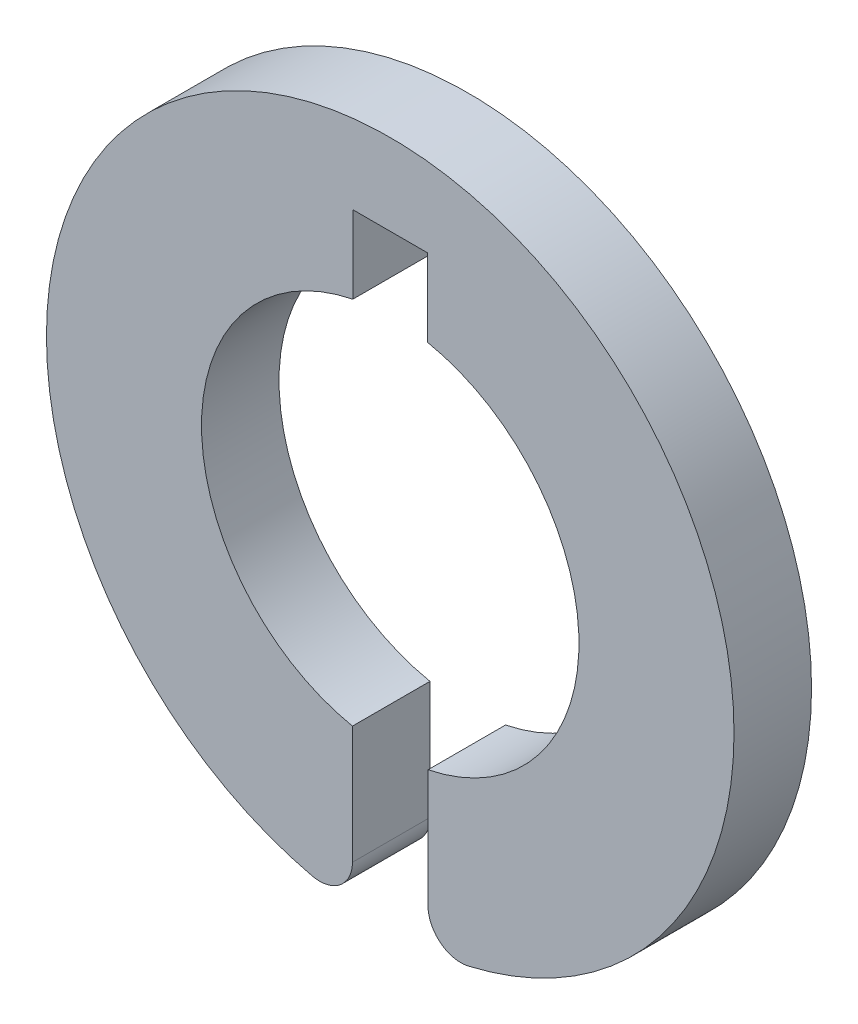
ISO-10303-21;
HEADER;
FILE_DESCRIPTION(('STEP AP214'),'2;1');
FILE_NAME('part.step','',(''),(''),'','','');
FILE_SCHEMA(('AUTOMOTIVE_DESIGN { 1 0 10303 214 1 1 1 1 }'));
ENDSEC;
DATA;
#1=APPLICATION_CONTEXT('core data for automotive mechanical design processes');
#2=APPLICATION_PROTOCOL_DEFINITION('international standard','automotive_design',2000,#1);
#3=PRODUCT_CONTEXT('',#1,'mechanical');
#4=PRODUCT('Part','Part','',(#3));
#5=PRODUCT_RELATED_PRODUCT_CATEGORY('part','',(#4));
#6=PRODUCT_DEFINITION_FORMATION('','',#4);
#7=PRODUCT_DEFINITION_CONTEXT('part definition',#1,'design');
#8=PRODUCT_DEFINITION('design','',#6,#7);
#9=PRODUCT_DEFINITION_SHAPE('','',#8);
#10=(LENGTH_UNIT() NAMED_UNIT(*) SI_UNIT(.MILLI.,.METRE.));
#11=(NAMED_UNIT(*) PLANE_ANGLE_UNIT() SI_UNIT($,.RADIAN.));
#12=(NAMED_UNIT(*) SI_UNIT($,.STERADIAN.) SOLID_ANGLE_UNIT());
#13=UNCERTAINTY_MEASURE_WITH_UNIT(LENGTH_MEASURE(1.E-05),#10,'distance_accuracy_value','');
#14=(GEOMETRIC_REPRESENTATION_CONTEXT(3) GLOBAL_UNCERTAINTY_ASSIGNED_CONTEXT((#13)) GLOBAL_UNIT_ASSIGNED_CONTEXT((#10,
#11,#12)) REPRESENTATION_CONTEXT('',''));
#15=CARTESIAN_POINT('',(0.,0.,0.));
#16=DIRECTION('',(0.,0.,1.));
#17=DIRECTION('',(1.,0.,0.));
#18=AXIS2_PLACEMENT_3D('',#15,#16,#17);
#19=CARTESIAN_POINT('',(0.,0.,3.));
#20=DIRECTION('',(0.,0.,-1.));
#21=DIRECTION('',(-1.,0.,0.));
#22=AXIS2_PLACEMENT_3D('',#19,#20,#21);
#23=CYLINDRICAL_SURFACE('',#22,7.3025);
#24=CARTESIAN_POINT('',(0.,0.,0.));
#25=DIRECTION('',(0.,0.,-1.));
#26=DIRECTION('',(1.,0.,0.));
#27=AXIS2_PLACEMENT_3D('',#24,#25,#26);
#28=CIRCLE('',#27,7.3025);
#29=CARTESIAN_POINT('',(1.4475,7.15760085503516,0.));
#30=VERTEX_POINT('',#29);
#31=CARTESIAN_POINT('',(1.4625,-7.15455099918926,0.));
#32=VERTEX_POINT('',#31);
#33=EDGE_CURVE('E138',#30,#32,#28,.T.);
#34=ORIENTED_EDGE('',*,*,#33,.T.);
#35=DIRECTION('',(0.,0.,-1.));
#36=VECTOR('',#35,1.);
#37=CARTESIAN_POINT('',(1.4625,-7.15455099918926,3.));
#38=LINE('',#37,#36);
#39=CARTESIAN_POINT('',(1.4625,-7.15455099918926,3.));
#40=VERTEX_POINT('',#39);
#41=EDGE_CURVE('E125',#40,#32,#38,.T.);
#42=ORIENTED_EDGE('',*,*,#41,.F.);
#43=CARTESIAN_POINT('',(0.,0.,3.));
#44=DIRECTION('',(0.,0.,-1.));
#45=DIRECTION('',(1.,0.,0.));
#46=AXIS2_PLACEMENT_3D('',#43,#44,#45);
#47=CIRCLE('',#46,7.3025);
#48=CARTESIAN_POINT('',(1.4475,7.15760085503516,3.));
#49=VERTEX_POINT('',#48);
#50=EDGE_CURVE('E130',#49,#40,#47,.T.);
#51=ORIENTED_EDGE('',*,*,#50,.F.);
#52=DIRECTION('',(0.,0.,-1.));
#53=VECTOR('',#52,1.);
#54=CARTESIAN_POINT('',(1.4475,7.15760085503516,3.));
#55=LINE('',#54,#53);
#56=EDGE_CURVE('E183',#49,#30,#55,.T.);
#57=ORIENTED_EDGE('',*,*,#56,.T.);
#58=EDGE_LOOP('',(#34,#42,#51,#57));
#59=FACE_BOUND('',#58,.T.);
#60=ADVANCED_FACE('F45',(#59),#23,.F.);
#61=CARTESIAN_POINT('',(1.4625,-13.2218606860003,3.));
#62=DIRECTION('',(1.,0.,0.));
#63=DIRECTION('',(0.,0.,-1.));
#64=AXIS2_PLACEMENT_3D('',#61,#62,#63);
#65=PLANE('',#64);
#66=DIRECTION('',(0.,-1.,0.));
#67=VECTOR('',#66,1.);
#68=CARTESIAN_POINT('',(1.4625,-13.2218606860003,0.));
#69=LINE('',#68,#67);
#70=CARTESIAN_POINT('',(1.4625,-11.7181269834389,0.));
#71=VERTEX_POINT('',#70);
#72=EDGE_CURVE('E186',#32,#71,#69,.T.);
#73=ORIENTED_EDGE('',*,*,#72,.T.);
#74=DIRECTION('',(0.,0.,-1.));
#75=VECTOR('',#74,1.);
#76=CARTESIAN_POINT('',(1.4625,-11.7181269834389,3.));
#77=LINE('',#76,#75);
#78=CARTESIAN_POINT('',(1.4625,-11.7181269834389,3.));
#79=VERTEX_POINT('',#78);
#80=EDGE_CURVE('E12',#71,#79,#77,.F.);
#81=ORIENTED_EDGE('',*,*,#80,.T.);
#82=DIRECTION('',(0.,-1.,0.));
#83=VECTOR('',#82,1.);
#84=CARTESIAN_POINT('',(1.4625,-13.2218606860003,3.));
#85=LINE('',#84,#83);
#86=EDGE_CURVE('E120',#40,#79,#85,.T.);
#87=ORIENTED_EDGE('',*,*,#86,.F.);
#88=ORIENTED_EDGE('',*,*,#41,.T.);
#89=EDGE_LOOP('',(#73,#81,#87,#88));
#90=FACE_BOUND('',#89,.T.);
#91=ADVANCED_FACE('F117',(#90),#65,.F.);
#92=CARTESIAN_POINT('',(0.,0.,3.));
#93=DIRECTION('',(0.,0.,-1.));
#94=DIRECTION('',(-1.,0.,0.));
#95=AXIS2_PLACEMENT_3D('',#92,#93,#94);
#96=CYLINDRICAL_SURFACE('',#95,13.3025);
#97=CARTESIAN_POINT('',(0.,0.,0.));
#98=DIRECTION('',(0.,0.,1.));
#99=DIRECTION('',(-1.,0.,0.));
#100=AXIS2_PLACEMENT_3D('',#97,#98,#99);
#101=CIRCLE('',#100,13.3025);
#102=CARTESIAN_POINT('',(3.02090847704135,-12.9549457051483,0.));
#103=VERTEX_POINT('',#102);
#104=CARTESIAN_POINT('',(-3.02090847704135,-12.9549457051483,0.));
#105=VERTEX_POINT('',#104);
#106=EDGE_CURVE('E188',#103,#105,#101,.T.);
#107=ORIENTED_EDGE('',*,*,#106,.T.);
#108=DIRECTION('',(0.,0.,-1.));
#109=VECTOR('',#108,1.);
#110=CARTESIAN_POINT('',(-3.02090847704135,-12.9549457051483,3.));
#111=LINE('',#110,#109);
#112=CARTESIAN_POINT('',(-3.02090847704135,-12.9549457051483,3.));
#113=VERTEX_POINT('',#112);
#114=EDGE_CURVE('E65',#105,#113,#111,.F.);
#115=ORIENTED_EDGE('',*,*,#114,.T.);
#116=CARTESIAN_POINT('',(0.,0.,3.));
#117=DIRECTION('',(0.,0.,1.));
#118=DIRECTION('',(-1.,0.,0.));
#119=AXIS2_PLACEMENT_3D('',#116,#117,#118);
#120=CIRCLE('',#119,13.3025);
#121=CARTESIAN_POINT('',(3.02090847704135,-12.9549457051483,3.));
#122=VERTEX_POINT('',#121);
#123=EDGE_CURVE('E127',#122,#113,#120,.T.);
#124=ORIENTED_EDGE('',*,*,#123,.F.);
#125=DIRECTION('',(0.,0.,-1.));
#126=VECTOR('',#125,1.);
#127=CARTESIAN_POINT('',(3.02090847704135,-12.9549457051483,3.));
#128=LINE('',#127,#126);
#129=EDGE_CURVE('E152',#122,#103,#128,.T.);
#130=ORIENTED_EDGE('',*,*,#129,.T.);
#131=EDGE_LOOP('',(#107,#115,#124,#130));
#132=FACE_BOUND('',#131,.T.);
#133=ADVANCED_FACE('F231',(#132),#96,.T.);
#134=CARTESIAN_POINT('',(-1.4625,-13.2218606860003,3.));
#135=DIRECTION('',(-1.,0.,0.));
#136=DIRECTION('',(0.,0.,1.));
#137=AXIS2_PLACEMENT_3D('',#134,#135,#136);
#138=PLANE('',#137);
#139=DIRECTION('',(0.,1.,0.));
#140=VECTOR('',#139,1.);
#141=CARTESIAN_POINT('',(-1.4625,-13.2218606860003,3.));
#142=LINE('',#141,#140);
#143=CARTESIAN_POINT('',(-1.4625,-11.7181269834389,3.));
#144=VERTEX_POINT('',#143);
#145=CARTESIAN_POINT('',(-1.4625,-7.15455099918926,3.));
#146=VERTEX_POINT('',#145);
#147=EDGE_CURVE('E169',#144,#146,#142,.T.);
#148=ORIENTED_EDGE('',*,*,#147,.F.);
#149=DIRECTION('',(0.,0.,-1.));
#150=VECTOR('',#149,1.);
#151=CARTESIAN_POINT('',(-1.4625,-11.7181269834389,3.));
#152=LINE('',#151,#150);
#153=CARTESIAN_POINT('',(-1.4625,-11.7181269834389,0.));
#154=VERTEX_POINT('',#153);
#155=EDGE_CURVE('E137',#144,#154,#152,.T.);
#156=ORIENTED_EDGE('',*,*,#155,.T.);
#157=DIRECTION('',(0.,1.,0.));
#158=VECTOR('',#157,1.);
#159=CARTESIAN_POINT('',(-1.4625,-13.2218606860003,0.));
#160=LINE('',#159,#158);
#161=CARTESIAN_POINT('',(-1.4625,-7.15455099918926,0.));
#162=VERTEX_POINT('',#161);
#163=EDGE_CURVE('E194',#154,#162,#160,.T.);
#164=ORIENTED_EDGE('',*,*,#163,.T.);
#165=DIRECTION('',(0.,0.,-1.));
#166=VECTOR('',#165,1.);
#167=CARTESIAN_POINT('',(-1.4625,-7.15455099918926,3.));
#168=LINE('',#167,#166);
#169=EDGE_CURVE('E143',#146,#162,#168,.T.);
#170=ORIENTED_EDGE('',*,*,#169,.F.);
#171=EDGE_LOOP('',(#148,#156,#164,#170));
#172=FACE_BOUND('',#171,.T.);
#173=ADVANCED_FACE('F240',(#172),#138,.F.);
#174=CARTESIAN_POINT('',(0.,0.,3.));
#175=DIRECTION('',(0.,0.,-1.));
#176=DIRECTION('',(-1.,0.,0.));
#177=AXIS2_PLACEMENT_3D('',#174,#175,#176);
#178=CYLINDRICAL_SURFACE('',#177,7.3025);
#179=CARTESIAN_POINT('',(0.,0.,0.));
#180=DIRECTION('',(0.,0.,-1.));
#181=DIRECTION('',(1.,0.,0.));
#182=AXIS2_PLACEMENT_3D('',#179,#180,#181);
#183=CIRCLE('',#182,7.3025);
#184=CARTESIAN_POINT('',(-1.4475,7.15760085503516,0.));
#185=VERTEX_POINT('',#184);
#186=EDGE_CURVE('E195',#162,#185,#183,.T.);
#187=ORIENTED_EDGE('',*,*,#186,.T.);
#188=DIRECTION('',(0.,0.,-1.));
#189=VECTOR('',#188,1.);
#190=CARTESIAN_POINT('',(-1.4475,7.15760085503516,3.));
#191=LINE('',#190,#189);
#192=CARTESIAN_POINT('',(-1.4475,7.15760085503516,3.));
#193=VERTEX_POINT('',#192);
#194=EDGE_CURVE('E150',#193,#185,#191,.T.);
#195=ORIENTED_EDGE('',*,*,#194,.F.);
#196=CARTESIAN_POINT('',(0.,0.,3.));
#197=DIRECTION('',(0.,0.,-1.));
#198=DIRECTION('',(1.,0.,0.));
#199=AXIS2_PLACEMENT_3D('',#196,#197,#198);
#200=CIRCLE('',#199,7.3025);
#201=EDGE_CURVE('E168',#146,#193,#200,.T.);
#202=ORIENTED_EDGE('',*,*,#201,.F.);
#203=ORIENTED_EDGE('',*,*,#169,.T.);
#204=EDGE_LOOP('',(#187,#195,#202,#203));
#205=FACE_BOUND('',#204,.T.);
#206=ADVANCED_FACE('F239',(#205),#178,.F.);
#207=CARTESIAN_POINT('',(-1.4475,10.1576008550352,3.));
#208=DIRECTION('',(-1.,0.,0.));
#209=DIRECTION('',(0.,-1.,0.));
#210=AXIS2_PLACEMENT_3D('',#207,#208,#209);
#211=PLANE('',#210);
#212=DIRECTION('',(0.,1.,0.));
#213=VECTOR('',#212,1.);
#214=CARTESIAN_POINT('',(-1.4475,10.1576008550352,0.));
#215=LINE('',#214,#213);
#216=CARTESIAN_POINT('',(-1.4475,10.1576008550352,0.));
#217=VERTEX_POINT('',#216);
#218=EDGE_CURVE('E192',#185,#217,#215,.T.);
#219=ORIENTED_EDGE('',*,*,#218,.T.);
#220=DIRECTION('',(0.,0.,-1.));
#221=VECTOR('',#220,1.);
#222=CARTESIAN_POINT('',(-1.4475,10.1576008550352,3.));
#223=LINE('',#222,#221);
#224=CARTESIAN_POINT('',(-1.4475,10.1576008550352,3.));
#225=VERTEX_POINT('',#224);
#226=EDGE_CURVE('E204',#225,#217,#223,.T.);
#227=ORIENTED_EDGE('',*,*,#226,.F.);
#228=DIRECTION('',(0.,1.,0.));
#229=VECTOR('',#228,1.);
#230=CARTESIAN_POINT('',(-1.4475,10.1576008550352,3.));
#231=LINE('',#230,#229);
#232=EDGE_CURVE('E173',#193,#225,#231,.T.);
#233=ORIENTED_EDGE('',*,*,#232,.F.);
#234=ORIENTED_EDGE('',*,*,#194,.T.);
#235=EDGE_LOOP('',(#219,#227,#233,#234));
#236=FACE_BOUND('',#235,.T.);
#237=ADVANCED_FACE('F211',(#236),#211,.F.);
#238=CARTESIAN_POINT('',(-1.4475,10.1576008550352,3.));
#239=DIRECTION('',(0.,1.,0.));
#240=DIRECTION('',(0.,0.,1.));
#241=AXIS2_PLACEMENT_3D('',#238,#239,#240);
#242=PLANE('',#241);
#243=DIRECTION('',(1.,0.,0.));
#244=VECTOR('',#243,1.);
#245=CARTESIAN_POINT('',(-1.4475,10.1576008550352,0.));
#246=LINE('',#245,#244);
#247=CARTESIAN_POINT('',(1.4475,10.1576008550352,0.));
#248=VERTEX_POINT('',#247);
#249=EDGE_CURVE('E197',#217,#248,#246,.T.);
#250=ORIENTED_EDGE('',*,*,#249,.T.);
#251=DIRECTION('',(0.,0.,-1.));
#252=VECTOR('',#251,1.);
#253=CARTESIAN_POINT('',(1.4475,10.1576008550352,3.));
#254=LINE('',#253,#252);
#255=CARTESIAN_POINT('',(1.4475,10.1576008550352,3.));
#256=VERTEX_POINT('',#255);
#257=EDGE_CURVE('E203',#256,#248,#254,.T.);
#258=ORIENTED_EDGE('',*,*,#257,.F.);
#259=DIRECTION('',(1.,0.,0.));
#260=VECTOR('',#259,1.);
#261=CARTESIAN_POINT('',(-1.4475,10.1576008550352,3.));
#262=LINE('',#261,#260);
#263=EDGE_CURVE('E180',#225,#256,#262,.T.);
#264=ORIENTED_EDGE('',*,*,#263,.F.);
#265=ORIENTED_EDGE('',*,*,#226,.T.);
#266=EDGE_LOOP('',(#250,#258,#264,#265));
#267=FACE_BOUND('',#266,.T.);
#268=ADVANCED_FACE('F224',(#267),#242,.F.);
#269=CARTESIAN_POINT('',(1.4475,10.1576008550352,3.));
#270=DIRECTION('',(1.,0.,0.));
#271=DIRECTION('',(0.,1.,0.));
#272=AXIS2_PLACEMENT_3D('',#269,#270,#271);
#273=PLANE('',#272);
#274=DIRECTION('',(0.,-1.,0.));
#275=VECTOR('',#274,1.);
#276=CARTESIAN_POINT('',(1.4475,10.1576008550352,0.));
#277=LINE('',#276,#275);
#278=EDGE_CURVE('E139',#248,#30,#277,.T.);
#279=ORIENTED_EDGE('',*,*,#278,.T.);
#280=ORIENTED_EDGE('',*,*,#56,.F.);
#281=DIRECTION('',(0.,-1.,0.));
#282=VECTOR('',#281,1.);
#283=CARTESIAN_POINT('',(1.4475,10.1576008550352,3.));
#284=LINE('',#283,#282);
#285=EDGE_CURVE('E131',#256,#49,#284,.T.);
#286=ORIENTED_EDGE('',*,*,#285,.F.);
#287=ORIENTED_EDGE('',*,*,#257,.T.);
#288=EDGE_LOOP('',(#279,#280,#286,#287));
#289=FACE_BOUND('',#288,.T.);
#290=ADVANCED_FACE('F229',(#289),#273,.F.);
#291=CARTESIAN_POINT('',(0.,0.,3.));
#292=DIRECTION('',(0.,0.,1.));
#293=DIRECTION('',(1.,0.,0.));
#294=AXIS2_PLACEMENT_3D('',#291,#292,#293);
#295=PLANE('',#294);
#296=ORIENTED_EDGE('',*,*,#123,.T.);
#297=CARTESIAN_POINT('',(-2.7325,-11.7181269834389,3.));
#298=DIRECTION('',(0.,0.,1.));
#299=DIRECTION('',(1.,0.,0.));
#300=AXIS2_PLACEMENT_3D('',#297,#298,#299);
#301=CIRCLE('',#300,1.27);
#302=EDGE_CURVE('E49',#113,#144,#301,.T.);
#303=ORIENTED_EDGE('',*,*,#302,.T.);
#304=ORIENTED_EDGE('',*,*,#147,.T.);
#305=ORIENTED_EDGE('',*,*,#201,.T.);
#306=ORIENTED_EDGE('',*,*,#232,.T.);
#307=ORIENTED_EDGE('',*,*,#263,.T.);
#308=ORIENTED_EDGE('',*,*,#285,.T.);
#309=ORIENTED_EDGE('',*,*,#50,.T.);
#310=ORIENTED_EDGE('',*,*,#86,.T.);
#311=CARTESIAN_POINT('',(2.7325,-11.7181269834389,3.));
#312=DIRECTION('',(0.,0.,1.));
#313=DIRECTION('',(1.,0.,0.));
#314=AXIS2_PLACEMENT_3D('',#311,#312,#313);
#315=CIRCLE('',#314,1.27);
#316=EDGE_CURVE('E160',#79,#122,#315,.T.);
#317=ORIENTED_EDGE('',*,*,#316,.T.);
#318=EDGE_LOOP('',(#296,#303,#304,#305,#306,#307,#308,#309,#310,#317));
#319=FACE_BOUND('',#318,.T.);
#320=ADVANCED_FACE('F128',(#319),#295,.T.);
#321=CARTESIAN_POINT('',(0.,0.,0.));
#322=DIRECTION('',(0.,0.,1.));
#323=DIRECTION('',(1.,0.,0.));
#324=AXIS2_PLACEMENT_3D('',#321,#322,#323);
#325=PLANE('',#324);
#326=ORIENTED_EDGE('',*,*,#163,.F.);
#327=CARTESIAN_POINT('',(-2.7325,-11.7181269834389,0.));
#328=DIRECTION('',(0.,0.,1.));
#329=DIRECTION('',(1.,0.,0.));
#330=AXIS2_PLACEMENT_3D('',#327,#328,#329);
#331=CIRCLE('',#330,1.27);
#332=EDGE_CURVE('E155',#154,#105,#331,.F.);
#333=ORIENTED_EDGE('',*,*,#332,.T.);
#334=ORIENTED_EDGE('',*,*,#106,.F.);
#335=CARTESIAN_POINT('',(2.7325,-11.7181269834389,0.));
#336=DIRECTION('',(0.,0.,1.));
#337=DIRECTION('',(1.,0.,0.));
#338=AXIS2_PLACEMENT_3D('',#335,#336,#337);
#339=CIRCLE('',#338,1.27);
#340=EDGE_CURVE('E145',#103,#71,#339,.F.);
#341=ORIENTED_EDGE('',*,*,#340,.T.);
#342=ORIENTED_EDGE('',*,*,#72,.F.);
#343=ORIENTED_EDGE('',*,*,#33,.F.);
#344=ORIENTED_EDGE('',*,*,#278,.F.);
#345=ORIENTED_EDGE('',*,*,#249,.F.);
#346=ORIENTED_EDGE('',*,*,#218,.F.);
#347=ORIENTED_EDGE('',*,*,#186,.F.);
#348=EDGE_LOOP('',(#326,#333,#334,#341,#342,#343,#344,#345,#346,#347));
#349=FACE_BOUND('',#348,.T.);
#350=ADVANCED_FACE('F218',(#349),#325,.F.);
#351=CARTESIAN_POINT('',(-2.7325,-11.7181269834389,3.));
#352=DIRECTION('',(0.,0.,-1.));
#353=DIRECTION('',(-1.,0.,0.));
#354=AXIS2_PLACEMENT_3D('',#351,#352,#353);
#355=CYLINDRICAL_SURFACE('',#354,1.27);
#356=ORIENTED_EDGE('',*,*,#302,.F.);
#357=ORIENTED_EDGE('',*,*,#114,.F.);
#358=ORIENTED_EDGE('',*,*,#332,.F.);
#359=ORIENTED_EDGE('',*,*,#155,.F.);
#360=EDGE_LOOP('',(#356,#357,#358,#359));
#361=FACE_BOUND('',#360,.T.);
#362=ADVANCED_FACE('F233',(#361),#355,.T.);
#363=CARTESIAN_POINT('',(2.7325,-11.7181269834389,3.));
#364=DIRECTION('',(0.,0.,-1.));
#365=DIRECTION('',(-1.,0.,0.));
#366=AXIS2_PLACEMENT_3D('',#363,#364,#365);
#367=CYLINDRICAL_SURFACE('',#366,1.27);
#368=ORIENTED_EDGE('',*,*,#316,.F.);
#369=ORIENTED_EDGE('',*,*,#80,.F.);
#370=ORIENTED_EDGE('',*,*,#340,.F.);
#371=ORIENTED_EDGE('',*,*,#129,.F.);
#372=EDGE_LOOP('',(#368,#369,#370,#371));
#373=FACE_BOUND('',#372,.T.);
#374=ADVANCED_FACE('F42',(#373),#367,.T.);
#375=CLOSED_SHELL('',(#60,#91,#133,#173,#206,#237,#268,#290,#320,#350,#362,#374));
#376=MANIFOLD_SOLID_BREP('B2',#375);
#377=ADVANCED_BREP_SHAPE_REPRESENTATION('',(#18,#376),#14);
#378=SHAPE_DEFINITION_REPRESENTATION(#9,#377);
ENDSEC;
END-ISO-10303-21;
